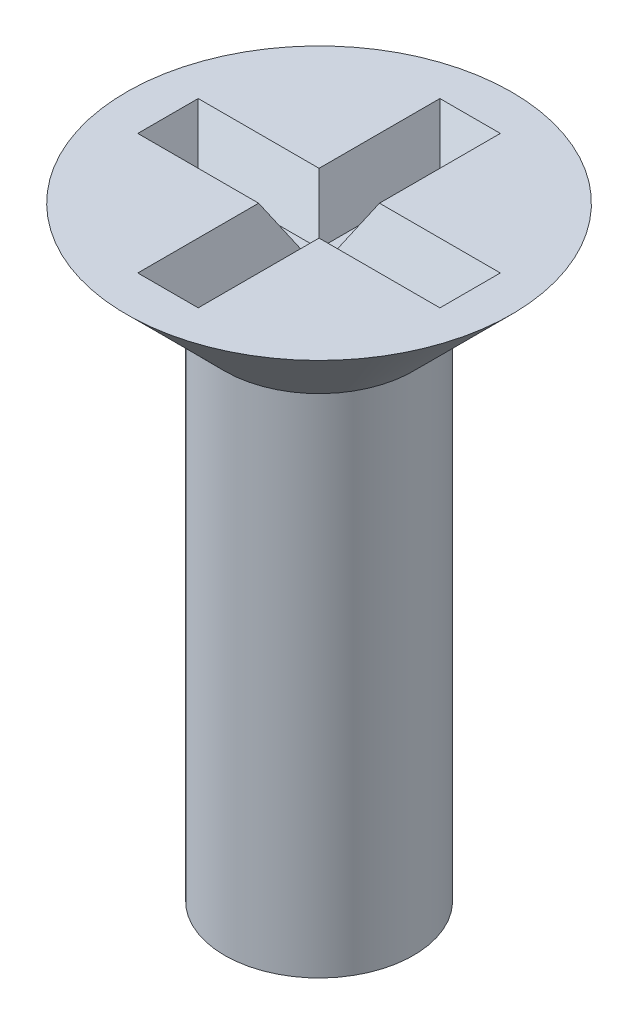
ISO-10303-21;
HEADER;
FILE_DESCRIPTION(('STEP AP214'),'2;1');
FILE_NAME('part.step','',(''),(''),'','','');
FILE_SCHEMA(('AUTOMOTIVE_DESIGN { 1 0 10303 214 1 1 1 1 }'));
ENDSEC;
DATA;
#1=APPLICATION_CONTEXT('core data for automotive mechanical design processes');
#2=APPLICATION_PROTOCOL_DEFINITION('international standard','automotive_design',2000,#1);
#3=PRODUCT_CONTEXT('',#1,'mechanical');
#4=PRODUCT('Part','Part','',(#3));
#5=PRODUCT_RELATED_PRODUCT_CATEGORY('part','',(#4));
#6=PRODUCT_DEFINITION_FORMATION('','',#4);
#7=PRODUCT_DEFINITION_CONTEXT('part definition',#1,'design');
#8=PRODUCT_DEFINITION('design','',#6,#7);
#9=PRODUCT_DEFINITION_SHAPE('','',#8);
#10=(LENGTH_UNIT() NAMED_UNIT(*) SI_UNIT(.MILLI.,.METRE.));
#11=(NAMED_UNIT(*) PLANE_ANGLE_UNIT() SI_UNIT($,.RADIAN.));
#12=(NAMED_UNIT(*) SI_UNIT($,.STERADIAN.) SOLID_ANGLE_UNIT());
#13=UNCERTAINTY_MEASURE_WITH_UNIT(LENGTH_MEASURE(1.E-05),#10,'distance_accuracy_value','');
#14=(GEOMETRIC_REPRESENTATION_CONTEXT(3) GLOBAL_UNCERTAINTY_ASSIGNED_CONTEXT((#13)) GLOBAL_UNIT_ASSIGNED_CONTEXT((#10,
#11,#12)) REPRESENTATION_CONTEXT('',''));
#15=CARTESIAN_POINT('',(0.,0.,0.));
#16=DIRECTION('',(0.,0.,1.));
#17=DIRECTION('',(1.,0.,0.));
#18=AXIS2_PLACEMENT_3D('',#15,#16,#17);
#19=CARTESIAN_POINT('',(0.,8.,0.));
#20=DIRECTION('',(0.,-1.,0.));
#21=DIRECTION('',(0.,0.,-1.));
#22=AXIS2_PLACEMENT_3D('',#19,#20,#21);
#23=PLANE('',#22);
#24=DIRECTION('',(-1.,0.,0.));
#25=VECTOR('',#24,1.);
#26=CARTESIAN_POINT('',(-0.4,8.,-2.));
#27=LINE('',#26,#25);
#28=CARTESIAN_POINT('',(0.4,8.,-2.));
#29=VERTEX_POINT('',#28);
#30=CARTESIAN_POINT('',(-0.4,8.,-2.));
#31=VERTEX_POINT('',#30);
#32=EDGE_CURVE('E147',#29,#31,#27,.T.);
#33=ORIENTED_EDGE('',*,*,#32,.F.);
#34=DIRECTION('',(0.,0.,-1.));
#35=VECTOR('',#34,1.);
#36=CARTESIAN_POINT('',(0.4,8.,-0.4));
#37=LINE('',#36,#35);
#38=CARTESIAN_POINT('',(0.4,8.,-0.4));
#39=VERTEX_POINT('',#38);
#40=EDGE_CURVE('E54',#39,#29,#37,.T.);
#41=ORIENTED_EDGE('',*,*,#40,.F.);
#42=DIRECTION('',(-1.,0.,0.));
#43=VECTOR('',#42,1.);
#44=CARTESIAN_POINT('',(0.4,8.,-0.4));
#45=LINE('',#44,#43);
#46=CARTESIAN_POINT('',(2.,8.,-0.4));
#47=VERTEX_POINT('',#46);
#48=EDGE_CURVE('E189',#47,#39,#45,.T.);
#49=ORIENTED_EDGE('',*,*,#48,.F.);
#50=DIRECTION('',(0.,0.,-1.));
#51=VECTOR('',#50,1.);
#52=CARTESIAN_POINT('',(2.,8.,0.4));
#53=LINE('',#52,#51);
#54=CARTESIAN_POINT('',(2.,8.,0.4));
#55=VERTEX_POINT('',#54);
#56=EDGE_CURVE('E186',#55,#47,#53,.T.);
#57=ORIENTED_EDGE('',*,*,#56,.F.);
#58=DIRECTION('',(1.,0.,0.));
#59=VECTOR('',#58,1.);
#60=CARTESIAN_POINT('',(0.4,8.,0.4));
#61=LINE('',#60,#59);
#62=CARTESIAN_POINT('',(0.4,8.,0.4));
#63=VERTEX_POINT('',#62);
#64=EDGE_CURVE('E182',#63,#55,#61,.T.);
#65=ORIENTED_EDGE('',*,*,#64,.F.);
#66=DIRECTION('',(0.,0.,-1.));
#67=VECTOR('',#66,1.);
#68=CARTESIAN_POINT('',(0.4,8.,2.));
#69=LINE('',#68,#67);
#70=CARTESIAN_POINT('',(0.4,8.,2.));
#71=VERTEX_POINT('',#70);
#72=EDGE_CURVE('E178',#71,#63,#69,.T.);
#73=ORIENTED_EDGE('',*,*,#72,.F.);
#74=DIRECTION('',(1.,0.,0.));
#75=VECTOR('',#74,1.);
#76=CARTESIAN_POINT('',(-0.4,8.,2.));
#77=LINE('',#76,#75);
#78=CARTESIAN_POINT('',(-0.4,8.,2.));
#79=VERTEX_POINT('',#78);
#80=EDGE_CURVE('E174',#79,#71,#77,.T.);
#81=ORIENTED_EDGE('',*,*,#80,.F.);
#82=DIRECTION('',(0.,0.,1.));
#83=VECTOR('',#82,1.);
#84=CARTESIAN_POINT('',(-0.4,8.,2.));
#85=LINE('',#84,#83);
#86=CARTESIAN_POINT('',(-0.4,8.,0.4));
#87=VERTEX_POINT('',#86);
#88=EDGE_CURVE('E170',#87,#79,#85,.T.);
#89=ORIENTED_EDGE('',*,*,#88,.F.);
#90=DIRECTION('',(1.,0.,0.));
#91=VECTOR('',#90,1.);
#92=CARTESIAN_POINT('',(-2.,8.,0.4));
#93=LINE('',#92,#91);
#94=CARTESIAN_POINT('',(-2.,8.,0.4));
#95=VERTEX_POINT('',#94);
#96=EDGE_CURVE('E166',#95,#87,#93,.T.);
#97=ORIENTED_EDGE('',*,*,#96,.F.);
#98=DIRECTION('',(0.,0.,1.));
#99=VECTOR('',#98,1.);
#100=CARTESIAN_POINT('',(-2.,8.,0.4));
#101=LINE('',#100,#99);
#102=CARTESIAN_POINT('',(-2.,8.,-0.4));
#103=VERTEX_POINT('',#102);
#104=EDGE_CURVE('E159',#103,#95,#101,.T.);
#105=ORIENTED_EDGE('',*,*,#104,.F.);
#106=DIRECTION('',(-1.,0.,0.));
#107=VECTOR('',#106,1.);
#108=CARTESIAN_POINT('',(-2.,8.,-0.4));
#109=LINE('',#108,#107);
#110=CARTESIAN_POINT('',(-0.4,8.,-0.4));
#111=VERTEX_POINT('',#110);
#112=EDGE_CURVE('E155',#111,#103,#109,.T.);
#113=ORIENTED_EDGE('',*,*,#112,.F.);
#114=DIRECTION('',(0.,0.,1.));
#115=VECTOR('',#114,1.);
#116=CARTESIAN_POINT('',(-0.4,8.,-0.4));
#117=LINE('',#116,#115);
#118=EDGE_CURVE('E137',#31,#111,#117,.T.);
#119=ORIENTED_EDGE('',*,*,#118,.F.);
#120=EDGE_LOOP('',(#33,#41,#49,#57,#65,#73,#81,#89,#97,#105,#113,#119));
#121=FACE_BOUND('',#120,.T.);
#122=CARTESIAN_POINT('',(0.,8.,0.));
#123=DIRECTION('',(0.,-1.,0.));
#124=DIRECTION('',(0.,0.,-1.));
#125=AXIS2_PLACEMENT_3D('',#122,#123,#124);
#126=CIRCLE('',#125,2.55);
#127=CARTESIAN_POINT('',(0.,8.,-2.55));
#128=VERTEX_POINT('',#127);
#129=EDGE_CURVE('E11',#128,#128,#126,.T.);
#130=ORIENTED_EDGE('',*,*,#129,.F.);
#131=EDGE_LOOP('',(#130));
#132=FACE_BOUND('',#131,.T.);
#133=ADVANCED_FACE('F39',(#121,#132),#23,.F.);
#134=CARTESIAN_POINT('',(0.,8.,0.));
#135=DIRECTION('',(0.,1.,0.));
#136=DIRECTION('',(0.,0.,1.));
#137=AXIS2_PLACEMENT_3D('',#134,#135,#136);
#138=CONICAL_SURFACE('',#137,2.55,0.785398163397443);
#139=CARTESIAN_POINT('',(0.,6.69999999999999,0.));
#140=DIRECTION('',(0.,-1.,0.));
#141=DIRECTION('',(0.,0.,-1.));
#142=AXIS2_PLACEMENT_3D('',#139,#140,#141);
#143=CIRCLE('',#142,1.25);
#144=CARTESIAN_POINT('',(0.,6.69999999999999,-1.25));
#145=VERTEX_POINT('',#144);
#146=EDGE_CURVE('E47',#145,#145,#143,.T.);
#147=ORIENTED_EDGE('',*,*,#146,.F.);
#148=EDGE_LOOP('',(#147));
#149=FACE_BOUND('',#148,.T.);
#150=ORIENTED_EDGE('',*,*,#129,.T.);
#151=EDGE_LOOP('',(#150));
#152=FACE_BOUND('',#151,.T.);
#153=ADVANCED_FACE('F275',(#149,#152),#138,.T.);
#154=CARTESIAN_POINT('',(0.,0.,0.));
#155=DIRECTION('',(0.,-1.,0.));
#156=DIRECTION('',(0.,0.,-1.));
#157=AXIS2_PLACEMENT_3D('',#154,#155,#156);
#158=CYLINDRICAL_SURFACE('',#157,1.25);
#159=CARTESIAN_POINT('',(0.,0.,0.));
#160=DIRECTION('',(0.,-1.,0.));
#161=DIRECTION('',(0.,0.,-1.));
#162=AXIS2_PLACEMENT_3D('',#159,#160,#161);
#163=CIRCLE('',#162,1.25);
#164=CARTESIAN_POINT('',(0.,0.,-1.25));
#165=VERTEX_POINT('',#164);
#166=EDGE_CURVE('E195',#165,#165,#163,.T.);
#167=ORIENTED_EDGE('',*,*,#166,.F.);
#168=EDGE_LOOP('',(#167));
#169=FACE_BOUND('',#168,.T.);
#170=ORIENTED_EDGE('',*,*,#146,.T.);
#171=EDGE_LOOP('',(#170));
#172=FACE_BOUND('',#171,.T.);
#173=ADVANCED_FACE('F273',(#169,#172),#158,.T.);
#174=CARTESIAN_POINT('',(-1.25,0.,0.));
#175=DIRECTION('',(0.,1.,0.));
#176=DIRECTION('',(0.,0.,1.));
#177=AXIS2_PLACEMENT_3D('',#174,#175,#176);
#178=PLANE('',#177);
#179=ORIENTED_EDGE('',*,*,#166,.T.);
#180=EDGE_LOOP('',(#179));
#181=FACE_BOUND('',#180,.T.);
#182=ADVANCED_FACE('F294',(#181),#178,.F.);
#183=CARTESIAN_POINT('',(0.4,8.,-0.4));
#184=DIRECTION('',(0.882947592858927,-0.469471562785891,0.));
#185=DIRECTION('',(0.469471562785891,0.882947592858927,0.));
#186=AXIS2_PLACEMENT_3D('',#183,#184,#185);
#187=PLANE('',#186);
#188=ORIENTED_EDGE('',*,*,#40,.T.);
#189=DIRECTION('',(0.42496930254486,0.79925101425589,-0.424969302544861));
#190=VECTOR('',#189,1.);
#191=CARTESIAN_POINT('',(0.111041747031255,7.45654856626144,-1.71104174703126));
#192=LINE('',#191,#190);
#193=CARTESIAN_POINT('',(0.0809743410031123,7.4,-1.68097434100311));
#194=VERTEX_POINT('',#193);
#195=EDGE_CURVE('E97',#194,#29,#192,.T.);
#196=ORIENTED_EDGE('',*,*,#195,.F.);
#197=DIRECTION('',(0.,0.,-1.));
#198=VECTOR('',#197,1.);
#199=CARTESIAN_POINT('',(0.0809743410031126,7.4,-0.4));
#200=LINE('',#199,#198);
#201=CARTESIAN_POINT('',(0.0809743410031127,7.4,-0.0809743410031126));
#202=VERTEX_POINT('',#201);
#203=EDGE_CURVE('E192',#202,#194,#200,.T.);
#204=ORIENTED_EDGE('',*,*,#203,.F.);
#205=DIRECTION('',(0.424969302544861,0.79925101425589,-0.424969302544861));
#206=VECTOR('',#205,1.);
#207=CARTESIAN_POINT('',(0.4,8.,-0.4));
#208=LINE('',#207,#206);
#209=EDGE_CURVE('E62',#202,#39,#208,.T.);
#210=ORIENTED_EDGE('',*,*,#209,.T.);
#211=EDGE_LOOP('',(#188,#196,#204,#210));
#212=FACE_BOUND('',#211,.T.);
#213=ADVANCED_FACE('F301',(#212),#187,.F.);
#214=CARTESIAN_POINT('',(0.4,8.,-0.4));
#215=DIRECTION('',(0.,-0.469471562785891,-0.882947592858927));
#216=DIRECTION('',(0.,0.882947592858927,-0.469471562785891));
#217=AXIS2_PLACEMENT_3D('',#214,#215,#216);
#218=PLANE('',#217);
#219=ORIENTED_EDGE('',*,*,#48,.T.);
#220=ORIENTED_EDGE('',*,*,#209,.F.);
#221=DIRECTION('',(-1.,0.,0.));
#222=VECTOR('',#221,1.);
#223=CARTESIAN_POINT('',(0.4,7.4,-0.0809743410031125));
#224=LINE('',#223,#222);
#225=CARTESIAN_POINT('',(1.68097434100311,7.4,-0.0809743410031126));
#226=VERTEX_POINT('',#225);
#227=EDGE_CURVE('E197',#226,#202,#224,.T.);
#228=ORIENTED_EDGE('',*,*,#227,.F.);
#229=DIRECTION('',(0.424969302544861,0.79925101425589,-0.424969302544861));
#230=VECTOR('',#229,1.);
#231=CARTESIAN_POINT('',(1.85552087351563,7.72827428313072,-0.255520873515628));
#232=LINE('',#231,#230);
#233=EDGE_CURVE('E102',#226,#47,#232,.T.);
#234=ORIENTED_EDGE('',*,*,#233,.T.);
#235=EDGE_LOOP('',(#219,#220,#228,#234));
#236=FACE_BOUND('',#235,.T.);
#237=ADVANCED_FACE('F308',(#236),#218,.F.);
#238=CARTESIAN_POINT('',(2.,8.,0.4));
#239=DIRECTION('',(0.882947592858927,-0.469471562785891,0.));
#240=DIRECTION('',(0.469471562785891,0.882947592858927,0.));
#241=AXIS2_PLACEMENT_3D('',#238,#239,#240);
#242=PLANE('',#241);
#243=ORIENTED_EDGE('',*,*,#56,.T.);
#244=ORIENTED_EDGE('',*,*,#233,.F.);
#245=DIRECTION('',(0.,0.,-1.));
#246=VECTOR('',#245,1.);
#247=CARTESIAN_POINT('',(1.68097434100311,7.4,0.4));
#248=LINE('',#247,#246);
#249=CARTESIAN_POINT('',(1.68097434100311,7.4,0.0809743410031122));
#250=VERTEX_POINT('',#249);
#251=EDGE_CURVE('E231',#250,#226,#248,.T.);
#252=ORIENTED_EDGE('',*,*,#251,.F.);
#253=DIRECTION('',(0.424969302544861,0.79925101425589,0.424969302544861));
#254=VECTOR('',#253,1.);
#255=CARTESIAN_POINT('',(1.71104174703126,7.45654856626144,0.111041747031255));
#256=LINE('',#255,#254);
#257=EDGE_CURVE('E219',#250,#55,#256,.T.);
#258=ORIENTED_EDGE('',*,*,#257,.T.);
#259=EDGE_LOOP('',(#243,#244,#252,#258));
#260=FACE_BOUND('',#259,.T.);
#261=ADVANCED_FACE('F315',(#260),#242,.F.);
#262=CARTESIAN_POINT('',(0.4,8.,0.4));
#263=DIRECTION('',(0.,-0.469471562785891,0.882947592858927));
#264=DIRECTION('',(0.,-0.882947592858927,-0.469471562785891));
#265=AXIS2_PLACEMENT_3D('',#262,#263,#264);
#266=PLANE('',#265);
#267=ORIENTED_EDGE('',*,*,#64,.T.);
#268=ORIENTED_EDGE('',*,*,#257,.F.);
#269=DIRECTION('',(1.,0.,0.));
#270=VECTOR('',#269,1.);
#271=CARTESIAN_POINT('',(0.4,7.4,0.0809743410031121));
#272=LINE('',#271,#270);
#273=CARTESIAN_POINT('',(0.0809743410031125,7.4,0.0809743410031121));
#274=VERTEX_POINT('',#273);
#275=EDGE_CURVE('E235',#274,#250,#272,.T.);
#276=ORIENTED_EDGE('',*,*,#275,.F.);
#277=DIRECTION('',(0.424969302544861,0.79925101425589,0.424969302544861));
#278=VECTOR('',#277,1.);
#279=CARTESIAN_POINT('',(0.4,8.,0.4));
#280=LINE('',#279,#278);
#281=EDGE_CURVE('E216',#274,#63,#280,.T.);
#282=ORIENTED_EDGE('',*,*,#281,.T.);
#283=EDGE_LOOP('',(#267,#268,#276,#282));
#284=FACE_BOUND('',#283,.T.);
#285=ADVANCED_FACE('F322',(#284),#266,.F.);
#286=CARTESIAN_POINT('',(0.4,8.,2.));
#287=DIRECTION('',(0.882947592858927,-0.469471562785891,0.));
#288=DIRECTION('',(0.469471562785891,0.882947592858927,0.));
#289=AXIS2_PLACEMENT_3D('',#286,#287,#288);
#290=PLANE('',#289);
#291=ORIENTED_EDGE('',*,*,#72,.T.);
#292=ORIENTED_EDGE('',*,*,#281,.F.);
#293=DIRECTION('',(0.,0.,-1.));
#294=VECTOR('',#293,1.);
#295=CARTESIAN_POINT('',(0.0809743410031124,7.4,2.));
#296=LINE('',#295,#294);
#297=CARTESIAN_POINT('',(0.0809743410031125,7.4,1.68097434100311));
#298=VERTEX_POINT('',#297);
#299=EDGE_CURVE('E239',#298,#274,#296,.T.);
#300=ORIENTED_EDGE('',*,*,#299,.F.);
#301=DIRECTION('',(0.424969302544861,0.79925101425589,0.424969302544861));
#302=VECTOR('',#301,1.);
#303=CARTESIAN_POINT('',(0.255520873515628,7.72827428313072,1.85552087351563));
#304=LINE('',#303,#302);
#305=EDGE_CURVE('E213',#298,#71,#304,.T.);
#306=ORIENTED_EDGE('',*,*,#305,.T.);
#307=EDGE_LOOP('',(#291,#292,#300,#306));
#308=FACE_BOUND('',#307,.T.);
#309=ADVANCED_FACE('F330',(#308),#290,.F.);
#310=CARTESIAN_POINT('',(-0.4,8.,2.));
#311=DIRECTION('',(0.,-0.469471562785891,0.882947592858927));
#312=DIRECTION('',(0.,-0.882947592858927,-0.469471562785891));
#313=AXIS2_PLACEMENT_3D('',#310,#311,#312);
#314=PLANE('',#313);
#315=ORIENTED_EDGE('',*,*,#80,.T.);
#316=ORIENTED_EDGE('',*,*,#305,.F.);
#317=DIRECTION('',(1.,0.,0.));
#318=VECTOR('',#317,1.);
#319=CARTESIAN_POINT('',(-0.4,7.4,1.68097434100311));
#320=LINE('',#319,#318);
#321=CARTESIAN_POINT('',(-0.0809743410031126,7.4,1.68097434100311));
#322=VERTEX_POINT('',#321);
#323=EDGE_CURVE('E243',#322,#298,#320,.T.);
#324=ORIENTED_EDGE('',*,*,#323,.F.);
#325=DIRECTION('',(-0.424969302544861,0.79925101425589,0.424969302544861));
#326=VECTOR('',#325,1.);
#327=CARTESIAN_POINT('',(-0.4,8.,2.));
#328=LINE('',#327,#326);
#329=EDGE_CURVE('E210',#322,#79,#328,.T.);
#330=ORIENTED_EDGE('',*,*,#329,.T.);
#331=EDGE_LOOP('',(#315,#316,#324,#330));
#332=FACE_BOUND('',#331,.T.);
#333=ADVANCED_FACE('F338',(#332),#314,.F.);
#334=CARTESIAN_POINT('',(-0.4,8.,2.));
#335=DIRECTION('',(-0.882947592858927,-0.469471562785891,0.));
#336=DIRECTION('',(0.469471562785891,-0.882947592858927,0.));
#337=AXIS2_PLACEMENT_3D('',#334,#335,#336);
#338=PLANE('',#337);
#339=ORIENTED_EDGE('',*,*,#88,.T.);
#340=ORIENTED_EDGE('',*,*,#329,.F.);
#341=DIRECTION('',(0.,0.,1.));
#342=VECTOR('',#341,1.);
#343=CARTESIAN_POINT('',(-0.0809743410031125,7.4,2.));
#344=LINE('',#343,#342);
#345=CARTESIAN_POINT('',(-0.0809743410031126,7.4,0.0809743410031123));
#346=VERTEX_POINT('',#345);
#347=EDGE_CURVE('E247',#346,#322,#344,.T.);
#348=ORIENTED_EDGE('',*,*,#347,.F.);
#349=DIRECTION('',(-0.424969302544861,0.79925101425589,0.424969302544861));
#350=VECTOR('',#349,1.);
#351=CARTESIAN_POINT('',(-0.688958252968745,8.54345143373856,0.688958252968744));
#352=LINE('',#351,#350);
#353=EDGE_CURVE('E207',#346,#87,#352,.T.);
#354=ORIENTED_EDGE('',*,*,#353,.T.);
#355=EDGE_LOOP('',(#339,#340,#348,#354));
#356=FACE_BOUND('',#355,.T.);
#357=ADVANCED_FACE('F346',(#356),#338,.F.);
#358=CARTESIAN_POINT('',(-2.,8.,0.4));
#359=DIRECTION('',(0.,-0.469471562785891,0.882947592858927));
#360=DIRECTION('',(0.,-0.882947592858927,-0.469471562785891));
#361=AXIS2_PLACEMENT_3D('',#358,#359,#360);
#362=PLANE('',#361);
#363=ORIENTED_EDGE('',*,*,#96,.T.);
#364=ORIENTED_EDGE('',*,*,#353,.F.);
#365=DIRECTION('',(1.,0.,0.));
#366=VECTOR('',#365,1.);
#367=CARTESIAN_POINT('',(-2.,7.4,0.0809743410031123));
#368=LINE('',#367,#366);
#369=CARTESIAN_POINT('',(-1.68097434100311,7.4,0.0809743410031123));
#370=VERTEX_POINT('',#369);
#371=EDGE_CURVE('E251',#370,#346,#368,.T.);
#372=ORIENTED_EDGE('',*,*,#371,.F.);
#373=DIRECTION('',(-0.424969302544861,0.79925101425589,0.424969302544861));
#374=VECTOR('',#373,1.);
#375=CARTESIAN_POINT('',(-2.,8.,0.4));
#376=LINE('',#375,#374);
#377=EDGE_CURVE('E204',#370,#95,#376,.T.);
#378=ORIENTED_EDGE('',*,*,#377,.T.);
#379=EDGE_LOOP('',(#363,#364,#372,#378));
#380=FACE_BOUND('',#379,.T.);
#381=ADVANCED_FACE('F354',(#380),#362,.F.);
#382=CARTESIAN_POINT('',(-2.,8.,0.4));
#383=DIRECTION('',(-0.882947592858927,-0.469471562785891,0.));
#384=DIRECTION('',(0.469471562785891,-0.882947592858927,0.));
#385=AXIS2_PLACEMENT_3D('',#382,#383,#384);
#386=PLANE('',#385);
#387=ORIENTED_EDGE('',*,*,#104,.T.);
#388=ORIENTED_EDGE('',*,*,#377,.F.);
#389=DIRECTION('',(0.,0.,1.));
#390=VECTOR('',#389,1.);
#391=CARTESIAN_POINT('',(-1.68097434100311,7.4,0.4));
#392=LINE('',#391,#390);
#393=CARTESIAN_POINT('',(-1.68097434100311,7.4,-0.0809743410031125));
#394=VERTEX_POINT('',#393);
#395=EDGE_CURVE('E255',#394,#370,#392,.T.);
#396=ORIENTED_EDGE('',*,*,#395,.F.);
#397=DIRECTION('',(-0.424969302544861,0.79925101425589,-0.424969302544861));
#398=VECTOR('',#397,1.);
#399=CARTESIAN_POINT('',(-2.,8.,-0.4));
#400=LINE('',#399,#398);
#401=EDGE_CURVE('E201',#394,#103,#400,.T.);
#402=ORIENTED_EDGE('',*,*,#401,.T.);
#403=EDGE_LOOP('',(#387,#388,#396,#402));
#404=FACE_BOUND('',#403,.T.);
#405=ADVANCED_FACE('F362',(#404),#386,.F.);
#406=CARTESIAN_POINT('',(-2.,8.,-0.4));
#407=DIRECTION('',(0.,-0.469471562785891,-0.882947592858927));
#408=DIRECTION('',(0.,0.882947592858927,-0.469471562785891));
#409=AXIS2_PLACEMENT_3D('',#406,#407,#408);
#410=PLANE('',#409);
#411=ORIENTED_EDGE('',*,*,#112,.T.);
#412=ORIENTED_EDGE('',*,*,#401,.F.);
#413=DIRECTION('',(-1.,0.,0.));
#414=VECTOR('',#413,1.);
#415=CARTESIAN_POINT('',(-2.,7.4,-0.0809743410031125));
#416=LINE('',#415,#414);
#417=CARTESIAN_POINT('',(-0.0809743410031125,7.4,-0.0809743410031122));
#418=VERTEX_POINT('',#417);
#419=EDGE_CURVE('E259',#418,#394,#416,.T.);
#420=ORIENTED_EDGE('',*,*,#419,.F.);
#421=DIRECTION('',(-0.424969302544861,0.79925101425589,-0.424969302544861));
#422=VECTOR('',#421,1.);
#423=CARTESIAN_POINT('',(-0.688958252968745,8.54345143373856,-0.688958252968744));
#424=LINE('',#423,#422);
#425=EDGE_CURVE('E144',#418,#111,#424,.T.);
#426=ORIENTED_EDGE('',*,*,#425,.T.);
#427=EDGE_LOOP('',(#411,#412,#420,#426));
#428=FACE_BOUND('',#427,.T.);
#429=ADVANCED_FACE('F370',(#428),#410,.F.);
#430=CARTESIAN_POINT('',(-0.4,8.,-0.4));
#431=DIRECTION('',(-0.882947592858927,-0.469471562785891,0.));
#432=DIRECTION('',(0.469471562785891,-0.882947592858927,0.));
#433=AXIS2_PLACEMENT_3D('',#430,#431,#432);
#434=PLANE('',#433);
#435=ORIENTED_EDGE('',*,*,#118,.T.);
#436=ORIENTED_EDGE('',*,*,#425,.F.);
#437=DIRECTION('',(0.,0.,1.));
#438=VECTOR('',#437,1.);
#439=CARTESIAN_POINT('',(-0.0809743410031125,7.4,-0.4));
#440=LINE('',#439,#438);
#441=CARTESIAN_POINT('',(-0.0809743410031125,7.4,-1.68097434100311));
#442=VERTEX_POINT('',#441);
#443=EDGE_CURVE('E140',#442,#418,#440,.T.);
#444=ORIENTED_EDGE('',*,*,#443,.F.);
#445=DIRECTION('',(-0.424969302544861,0.79925101425589,-0.424969302544861));
#446=VECTOR('',#445,1.);
#447=CARTESIAN_POINT('',(-0.4,8.,-2.));
#448=LINE('',#447,#446);
#449=EDGE_CURVE('E133',#442,#31,#448,.T.);
#450=ORIENTED_EDGE('',*,*,#449,.T.);
#451=EDGE_LOOP('',(#435,#436,#444,#450));
#452=FACE_BOUND('',#451,.T.);
#453=ADVANCED_FACE('F135',(#452),#434,.F.);
#454=CARTESIAN_POINT('',(-0.4,8.,-2.));
#455=DIRECTION('',(0.,-0.469471562785891,-0.882947592858927));
#456=DIRECTION('',(0.,0.882947592858927,-0.469471562785891));
#457=AXIS2_PLACEMENT_3D('',#454,#455,#456);
#458=PLANE('',#457);
#459=ORIENTED_EDGE('',*,*,#32,.T.);
#460=ORIENTED_EDGE('',*,*,#449,.F.);
#461=DIRECTION('',(-1.,0.,0.));
#462=VECTOR('',#461,1.);
#463=CARTESIAN_POINT('',(-0.4,7.4,-1.68097434100311));
#464=LINE('',#463,#462);
#465=EDGE_CURVE('E227',#194,#442,#464,.T.);
#466=ORIENTED_EDGE('',*,*,#465,.F.);
#467=ORIENTED_EDGE('',*,*,#195,.T.);
#468=EDGE_LOOP('',(#459,#460,#466,#467));
#469=FACE_BOUND('',#468,.T.);
#470=ADVANCED_FACE('F148',(#469),#458,.F.);
#471=CARTESIAN_POINT('',(0.,7.4,0.));
#472=DIRECTION('',(0.,-1.,0.));
#473=DIRECTION('',(0.,0.,-1.));
#474=AXIS2_PLACEMENT_3D('',#471,#472,#473);
#475=PLANE('',#474);
#476=ORIENTED_EDGE('',*,*,#203,.T.);
#477=ORIENTED_EDGE('',*,*,#465,.T.);
#478=ORIENTED_EDGE('',*,*,#443,.T.);
#479=ORIENTED_EDGE('',*,*,#419,.T.);
#480=ORIENTED_EDGE('',*,*,#395,.T.);
#481=ORIENTED_EDGE('',*,*,#371,.T.);
#482=ORIENTED_EDGE('',*,*,#347,.T.);
#483=ORIENTED_EDGE('',*,*,#323,.T.);
#484=ORIENTED_EDGE('',*,*,#299,.T.);
#485=ORIENTED_EDGE('',*,*,#275,.T.);
#486=ORIENTED_EDGE('',*,*,#251,.T.);
#487=ORIENTED_EDGE('',*,*,#227,.T.);
#488=EDGE_LOOP('',(#476,#477,#478,#479,#480,#481,#482,#483,#484,#485,#486,#487));
#489=FACE_BOUND('',#488,.T.);
#490=ADVANCED_FACE('F391',(#489),#475,.F.);
#491=CLOSED_SHELL('',(#133,#153,#173,#182,#213,#237,#261,#285,#309,#333,#357,#381,#405,#429,
#453,#470,#490));
#492=MANIFOLD_SOLID_BREP('B2',#491);
#493=ADVANCED_BREP_SHAPE_REPRESENTATION('',(#18,#492),#14);
#494=SHAPE_DEFINITION_REPRESENTATION(#9,#493);
ENDSEC;
END-ISO-10303-21;
